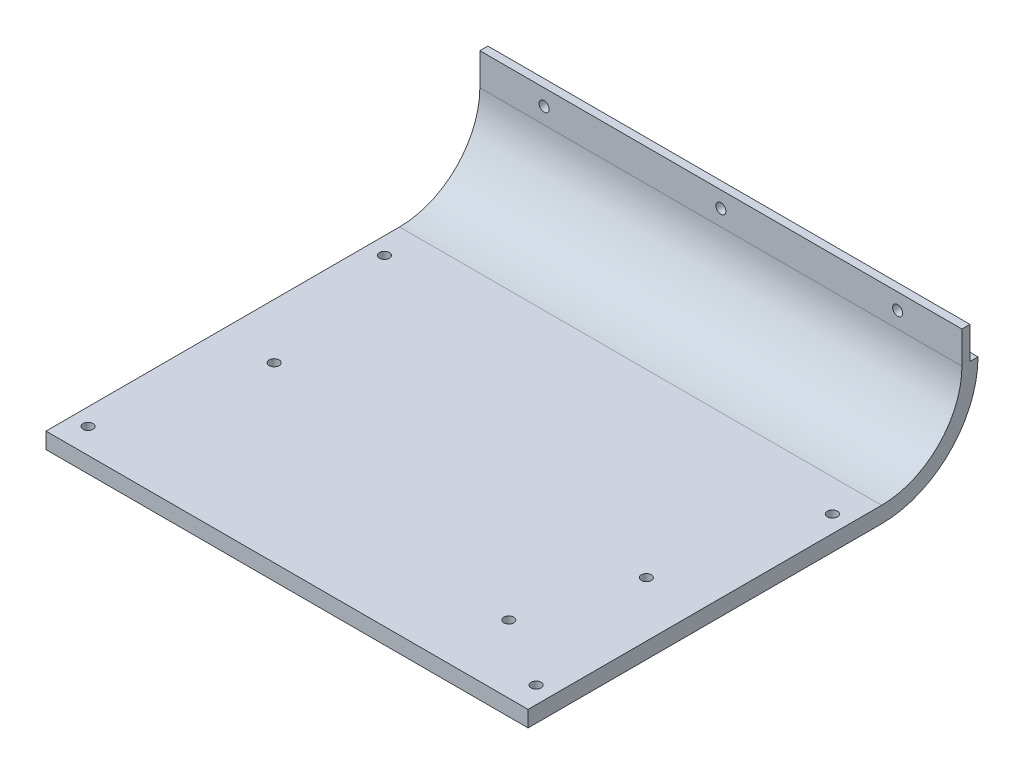
ISO-10303-21;
HEADER;
FILE_DESCRIPTION(('STEP AP214'),'2;1');
FILE_NAME('part.step','',(''),(''),'','','');
FILE_SCHEMA(('AUTOMOTIVE_DESIGN { 1 0 10303 214 1 1 1 1 }'));
ENDSEC;
DATA;
#1=APPLICATION_CONTEXT('core data for automotive mechanical design processes');
#2=APPLICATION_PROTOCOL_DEFINITION('international standard','automotive_design',2000,#1);
#3=PRODUCT_CONTEXT('',#1,'mechanical');
#4=PRODUCT('Part','Part','',(#3));
#5=PRODUCT_RELATED_PRODUCT_CATEGORY('part','',(#4));
#6=PRODUCT_DEFINITION_FORMATION('','',#4);
#7=PRODUCT_DEFINITION_CONTEXT('part definition',#1,'design');
#8=PRODUCT_DEFINITION('design','',#6,#7);
#9=PRODUCT_DEFINITION_SHAPE('','',#8);
#10=(LENGTH_UNIT() NAMED_UNIT(*) SI_UNIT(.MILLI.,.METRE.));
#11=(NAMED_UNIT(*) PLANE_ANGLE_UNIT() SI_UNIT($,.RADIAN.));
#12=(NAMED_UNIT(*) SI_UNIT($,.STERADIAN.) SOLID_ANGLE_UNIT());
#13=UNCERTAINTY_MEASURE_WITH_UNIT(LENGTH_MEASURE(1.E-05),#10,'distance_accuracy_value','');
#14=(GEOMETRIC_REPRESENTATION_CONTEXT(3) GLOBAL_UNCERTAINTY_ASSIGNED_CONTEXT((#13)) GLOBAL_UNIT_ASSIGNED_CONTEXT((#10,
#11,#12)) REPRESENTATION_CONTEXT('',''));
#15=CARTESIAN_POINT('',(0.,0.,0.));
#16=DIRECTION('',(0.,0.,1.));
#17=DIRECTION('',(1.,0.,0.));
#18=AXIS2_PLACEMENT_3D('',#15,#16,#17);
#19=CARTESIAN_POINT('',(-190.5,76.2,-139.7));
#20=DIRECTION('',(1.,0.,0.));
#21=DIRECTION('',(0.,0.,-1.));
#22=AXIS2_PLACEMENT_3D('',#19,#20,#21);
#23=CYLINDRICAL_SURFACE('',#22,76.2);
#24=DIRECTION('',(1.,0.,0.));
#25=VECTOR('',#24,1.);
#26=CARTESIAN_POINT('',(-190.5,76.2,-215.9));
#27=LINE('',#26,#25);
#28=CARTESIAN_POINT('',(-190.5,76.2,-215.9));
#29=VERTEX_POINT('',#28);
#30=CARTESIAN_POINT('',(190.5,76.2,-215.9));
#31=VERTEX_POINT('',#30);
#32=EDGE_CURVE('E50',#29,#31,#27,.T.);
#33=ORIENTED_EDGE('',*,*,#32,.T.);
#34=CARTESIAN_POINT('',(190.5,76.2,-139.7));
#35=DIRECTION('',(1.,0.,0.));
#36=DIRECTION('',(0.,0.,1.));
#37=AXIS2_PLACEMENT_3D('',#34,#35,#36);
#38=CIRCLE('',#37,76.2);
#39=CARTESIAN_POINT('',(190.5,0.,-139.7));
#40=VERTEX_POINT('',#39);
#41=EDGE_CURVE('E149',#40,#31,#38,.T.);
#42=ORIENTED_EDGE('',*,*,#41,.F.);
#43=DIRECTION('',(1.,0.,0.));
#44=VECTOR('',#43,1.);
#45=CARTESIAN_POINT('',(-190.5,0.,-139.7));
#46=LINE('',#45,#44);
#47=CARTESIAN_POINT('',(-190.5,0.,-139.7));
#48=VERTEX_POINT('',#47);
#49=EDGE_CURVE('E11',#48,#40,#46,.T.);
#50=ORIENTED_EDGE('',*,*,#49,.F.);
#51=CARTESIAN_POINT('',(-190.5,76.2,-139.7));
#52=DIRECTION('',(1.,0.,0.));
#53=DIRECTION('',(0.,0.,1.));
#54=AXIS2_PLACEMENT_3D('',#51,#52,#53);
#55=CIRCLE('',#54,76.2);
#56=EDGE_CURVE('E180',#48,#29,#55,.T.);
#57=ORIENTED_EDGE('',*,*,#56,.T.);
#58=EDGE_LOOP('',(#33,#42,#50,#57));
#59=FACE_BOUND('',#58,.T.);
#60=ADVANCED_FACE('F47',(#59),#23,.T.);
#61=CARTESIAN_POINT('',(-190.5,0.,139.7));
#62=DIRECTION('',(0.,-1.,0.));
#63=DIRECTION('',(0.,0.,-1.));
#64=AXIS2_PLACEMENT_3D('',#61,#62,#63);
#65=PLANE('',#64);
#66=CARTESIAN_POINT('',(-177.038,0.,119.888));
#67=DIRECTION('',(0.,1.,0.));
#68=DIRECTION('',(0.,0.,-1.));
#69=AXIS2_PLACEMENT_3D('',#66,#67,#68);
#70=CIRCLE('',#69,3.937);
#71=CARTESIAN_POINT('',(-177.038,0.,115.951));
#72=VERTEX_POINT('',#71);
#73=EDGE_CURVE('E343',#72,#72,#70,.T.);
#74=ORIENTED_EDGE('',*,*,#73,.T.);
#75=EDGE_LOOP('',(#74));
#76=FACE_BOUND('',#75,.T.);
#77=CARTESIAN_POINT('',(177.038,0.,-114.3));
#78=DIRECTION('',(0.,1.,0.));
#79=DIRECTION('',(0.,0.,1.));
#80=AXIS2_PLACEMENT_3D('',#77,#78,#79);
#81=CIRCLE('',#80,3.937);
#82=CARTESIAN_POINT('',(177.038,0.,-110.363));
#83=VERTEX_POINT('',#82);
#84=EDGE_CURVE('E331',#83,#83,#81,.T.);
#85=ORIENTED_EDGE('',*,*,#84,.T.);
#86=EDGE_LOOP('',(#85));
#87=FACE_BOUND('',#86,.T.);
#88=CARTESIAN_POINT('',(177.038,0.,119.888));
#89=DIRECTION('',(0.,1.,0.));
#90=DIRECTION('',(0.,0.,1.));
#91=AXIS2_PLACEMENT_3D('',#88,#89,#90);
#92=CIRCLE('',#91,3.937);
#93=CARTESIAN_POINT('',(177.038,0.,123.825));
#94=VERTEX_POINT('',#93);
#95=EDGE_CURVE('E319',#94,#94,#92,.T.);
#96=ORIENTED_EDGE('',*,*,#95,.T.);
#97=EDGE_LOOP('',(#96));
#98=FACE_BOUND('',#97,.T.);
#99=CARTESIAN_POINT('',(-147.066,0.,2.79399999999996));
#100=DIRECTION('',(0.,1.,0.));
#101=DIRECTION('',(0.,0.,1.));
#102=AXIS2_PLACEMENT_3D('',#99,#100,#101);
#103=CIRCLE('',#102,3.937);
#104=CARTESIAN_POINT('',(-147.066,0.,6.73099999999996));
#105=VERTEX_POINT('',#104);
#106=EDGE_CURVE('E307',#105,#105,#103,.T.);
#107=ORIENTED_EDGE('',*,*,#106,.T.);
#108=EDGE_LOOP('',(#107));
#109=FACE_BOUND('',#108,.T.);
#110=CARTESIAN_POINT('',(-177.038,0.,-114.3));
#111=DIRECTION('',(0.,1.,0.));
#112=DIRECTION('',(0.,0.,-1.));
#113=AXIS2_PLACEMENT_3D('',#110,#111,#112);
#114=CIRCLE('',#113,3.937);
#115=CARTESIAN_POINT('',(-177.038,0.,-118.237));
#116=VERTEX_POINT('',#115);
#117=EDGE_CURVE('E355',#116,#116,#114,.T.);
#118=ORIENTED_EDGE('',*,*,#117,.T.);
#119=EDGE_LOOP('',(#118));
#120=FACE_BOUND('',#119,.T.);
#121=CARTESIAN_POINT('',(121.666,0.,86.106));
#122=DIRECTION('',(0.,1.,0.));
#123=DIRECTION('',(0.,0.,1.));
#124=AXIS2_PLACEMENT_3D('',#121,#122,#123);
#125=CIRCLE('',#124,3.93700000000001);
#126=CARTESIAN_POINT('',(121.666,0.,90.043));
#127=VERTEX_POINT('',#126);
#128=EDGE_CURVE('E367',#127,#127,#125,.T.);
#129=ORIENTED_EDGE('',*,*,#128,.T.);
#130=EDGE_LOOP('',(#129));
#131=FACE_BOUND('',#130,.T.);
#132=CARTESIAN_POINT('',(147.066,0.,2.79399999999996));
#133=DIRECTION('',(0.,1.,0.));
#134=DIRECTION('',(0.,0.,1.));
#135=AXIS2_PLACEMENT_3D('',#132,#133,#134);
#136=CIRCLE('',#135,3.937);
#137=CARTESIAN_POINT('',(147.066,0.,6.73099999999996));
#138=VERTEX_POINT('',#137);
#139=EDGE_CURVE('E289',#138,#138,#136,.T.);
#140=ORIENTED_EDGE('',*,*,#139,.T.);
#141=EDGE_LOOP('',(#140));
#142=FACE_BOUND('',#141,.T.);
#143=ORIENTED_EDGE('',*,*,#49,.T.);
#144=DIRECTION('',(0.,0.,-1.));
#145=VECTOR('',#144,1.);
#146=CARTESIAN_POINT('',(190.5,0.,139.7));
#147=LINE('',#146,#145);
#148=CARTESIAN_POINT('',(190.5,0.,139.7));
#149=VERTEX_POINT('',#148);
#150=EDGE_CURVE('E176',#149,#40,#147,.T.);
#151=ORIENTED_EDGE('',*,*,#150,.F.);
#152=DIRECTION('',(1.,0.,0.));
#153=VECTOR('',#152,1.);
#154=CARTESIAN_POINT('',(-190.5,0.,139.7));
#155=LINE('',#154,#153);
#156=CARTESIAN_POINT('',(-190.5,0.,139.7));
#157=VERTEX_POINT('',#156);
#158=EDGE_CURVE('E56',#157,#149,#155,.T.);
#159=ORIENTED_EDGE('',*,*,#158,.F.);
#160=DIRECTION('',(0.,0.,-1.));
#161=VECTOR('',#160,1.);
#162=CARTESIAN_POINT('',(-190.5,0.,139.7));
#163=LINE('',#162,#161);
#164=EDGE_CURVE('E196',#157,#48,#163,.T.);
#165=ORIENTED_EDGE('',*,*,#164,.T.);
#166=EDGE_LOOP('',(#143,#151,#159,#165));
#167=FACE_BOUND('',#166,.T.);
#168=ADVANCED_FACE('F223',(#76,#87,#98,#109,#120,#131,#142,#167),#65,.T.);
#169=CARTESIAN_POINT('',(-190.5,0.,139.7));
#170=DIRECTION('',(0.,0.,1.));
#171=DIRECTION('',(1.,0.,0.));
#172=AXIS2_PLACEMENT_3D('',#169,#170,#171);
#173=PLANE('',#172);
#174=ORIENTED_EDGE('',*,*,#158,.T.);
#175=DIRECTION('',(0.,-1.,0.));
#176=VECTOR('',#175,1.);
#177=CARTESIAN_POINT('',(190.5,0.,139.7));
#178=LINE('',#177,#176);
#179=CARTESIAN_POINT('',(190.5,12.7,139.7));
#180=VERTEX_POINT('',#179);
#181=EDGE_CURVE('E172',#180,#149,#178,.T.);
#182=ORIENTED_EDGE('',*,*,#181,.F.);
#183=DIRECTION('',(1.,0.,0.));
#184=VECTOR('',#183,1.);
#185=CARTESIAN_POINT('',(-190.5,12.7,139.7));
#186=LINE('',#185,#184);
#187=CARTESIAN_POINT('',(-190.5,12.7,139.7));
#188=VERTEX_POINT('',#187);
#189=EDGE_CURVE('E202',#188,#180,#186,.T.);
#190=ORIENTED_EDGE('',*,*,#189,.F.);
#191=DIRECTION('',(0.,-1.,0.));
#192=VECTOR('',#191,1.);
#193=CARTESIAN_POINT('',(-190.5,0.,139.7));
#194=LINE('',#193,#192);
#195=EDGE_CURVE('E192',#188,#157,#194,.T.);
#196=ORIENTED_EDGE('',*,*,#195,.T.);
#197=EDGE_LOOP('',(#174,#182,#190,#196));
#198=FACE_BOUND('',#197,.T.);
#199=ADVANCED_FACE('F390',(#198),#173,.T.);
#200=CARTESIAN_POINT('',(-190.5,12.7,139.7));
#201=DIRECTION('',(0.,1.,0.));
#202=DIRECTION('',(0.,0.,1.));
#203=AXIS2_PLACEMENT_3D('',#200,#201,#202);
#204=PLANE('',#203);
#205=CARTESIAN_POINT('',(-177.038,12.7,119.888));
#206=DIRECTION('',(0.,1.,0.));
#207=DIRECTION('',(0.,0.,-1.));
#208=AXIS2_PLACEMENT_3D('',#205,#206,#207);
#209=CIRCLE('',#208,3.937);
#210=CARTESIAN_POINT('',(-177.038,12.7,115.951));
#211=VERTEX_POINT('',#210);
#212=EDGE_CURVE('E337',#211,#211,#209,.T.);
#213=ORIENTED_EDGE('',*,*,#212,.F.);
#214=EDGE_LOOP('',(#213));
#215=FACE_BOUND('',#214,.T.);
#216=CARTESIAN_POINT('',(177.038,12.7,-114.3));
#217=DIRECTION('',(0.,1.,0.));
#218=DIRECTION('',(0.,0.,1.));
#219=AXIS2_PLACEMENT_3D('',#216,#217,#218);
#220=CIRCLE('',#219,3.937);
#221=CARTESIAN_POINT('',(177.038,12.7,-110.363));
#222=VERTEX_POINT('',#221);
#223=EDGE_CURVE('E325',#222,#222,#220,.T.);
#224=ORIENTED_EDGE('',*,*,#223,.F.);
#225=EDGE_LOOP('',(#224));
#226=FACE_BOUND('',#225,.T.);
#227=CARTESIAN_POINT('',(177.038,12.7,119.888));
#228=DIRECTION('',(0.,1.,0.));
#229=DIRECTION('',(0.,0.,1.));
#230=AXIS2_PLACEMENT_3D('',#227,#228,#229);
#231=CIRCLE('',#230,3.937);
#232=CARTESIAN_POINT('',(177.038,12.7,123.825));
#233=VERTEX_POINT('',#232);
#234=EDGE_CURVE('E313',#233,#233,#231,.T.);
#235=ORIENTED_EDGE('',*,*,#234,.F.);
#236=EDGE_LOOP('',(#235));
#237=FACE_BOUND('',#236,.T.);
#238=CARTESIAN_POINT('',(-147.066,12.7,2.79399999999996));
#239=DIRECTION('',(0.,1.,0.));
#240=DIRECTION('',(0.,0.,1.));
#241=AXIS2_PLACEMENT_3D('',#238,#239,#240);
#242=CIRCLE('',#241,3.937);
#243=CARTESIAN_POINT('',(-147.066,12.7,6.73099999999996));
#244=VERTEX_POINT('',#243);
#245=EDGE_CURVE('E301',#244,#244,#242,.T.);
#246=ORIENTED_EDGE('',*,*,#245,.F.);
#247=EDGE_LOOP('',(#246));
#248=FACE_BOUND('',#247,.T.);
#249=CARTESIAN_POINT('',(-177.038,12.7,-114.3));
#250=DIRECTION('',(0.,1.,0.));
#251=DIRECTION('',(0.,0.,-1.));
#252=AXIS2_PLACEMENT_3D('',#249,#250,#251);
#253=CIRCLE('',#252,3.937);
#254=CARTESIAN_POINT('',(-177.038,12.7,-118.237));
#255=VERTEX_POINT('',#254);
#256=EDGE_CURVE('E349',#255,#255,#253,.T.);
#257=ORIENTED_EDGE('',*,*,#256,.F.);
#258=EDGE_LOOP('',(#257));
#259=FACE_BOUND('',#258,.T.);
#260=CARTESIAN_POINT('',(121.666,12.7,86.106));
#261=DIRECTION('',(0.,1.,0.));
#262=DIRECTION('',(0.,0.,1.));
#263=AXIS2_PLACEMENT_3D('',#260,#261,#262);
#264=CIRCLE('',#263,3.93700000000001);
#265=CARTESIAN_POINT('',(121.666,12.7,90.043));
#266=VERTEX_POINT('',#265);
#267=EDGE_CURVE('E361',#266,#266,#264,.T.);
#268=ORIENTED_EDGE('',*,*,#267,.F.);
#269=EDGE_LOOP('',(#268));
#270=FACE_BOUND('',#269,.T.);
#271=CARTESIAN_POINT('',(147.066,12.7,2.79399999999996));
#272=DIRECTION('',(0.,1.,0.));
#273=DIRECTION('',(0.,0.,1.));
#274=AXIS2_PLACEMENT_3D('',#271,#272,#273);
#275=CIRCLE('',#274,3.937);
#276=CARTESIAN_POINT('',(147.066,12.7,6.73099999999996));
#277=VERTEX_POINT('',#276);
#278=EDGE_CURVE('E295',#277,#277,#275,.T.);
#279=ORIENTED_EDGE('',*,*,#278,.F.);
#280=EDGE_LOOP('',(#279));
#281=FACE_BOUND('',#280,.T.);
#282=ORIENTED_EDGE('',*,*,#189,.T.);
#283=DIRECTION('',(0.,0.,1.));
#284=VECTOR('',#283,1.);
#285=CARTESIAN_POINT('',(190.5,12.7,139.7));
#286=LINE('',#285,#284);
#287=CARTESIAN_POINT('',(190.5,12.7,-139.7));
#288=VERTEX_POINT('',#287);
#289=EDGE_CURVE('E168',#288,#180,#286,.T.);
#290=ORIENTED_EDGE('',*,*,#289,.F.);
#291=DIRECTION('',(1.,0.,0.));
#292=VECTOR('',#291,1.);
#293=CARTESIAN_POINT('',(-190.5,12.7,-139.7));
#294=LINE('',#293,#292);
#295=CARTESIAN_POINT('',(-190.5,12.7,-139.7));
#296=VERTEX_POINT('',#295);
#297=EDGE_CURVE('E205',#296,#288,#294,.T.);
#298=ORIENTED_EDGE('',*,*,#297,.F.);
#299=DIRECTION('',(0.,0.,1.));
#300=VECTOR('',#299,1.);
#301=CARTESIAN_POINT('',(-190.5,12.7,139.7));
#302=LINE('',#301,#300);
#303=EDGE_CURVE('E188',#296,#188,#302,.T.);
#304=ORIENTED_EDGE('',*,*,#303,.T.);
#305=EDGE_LOOP('',(#282,#290,#298,#304));
#306=FACE_BOUND('',#305,.T.);
#307=ADVANCED_FACE('F386',(#215,#226,#237,#248,#259,#270,#281,#306),#204,.T.);
#308=CARTESIAN_POINT('',(-190.5,76.2,-139.7));
#309=DIRECTION('',(1.,0.,0.));
#310=DIRECTION('',(0.,0.,-1.));
#311=AXIS2_PLACEMENT_3D('',#308,#309,#310);
#312=CYLINDRICAL_SURFACE('',#311,63.5);
#313=ORIENTED_EDGE('',*,*,#297,.T.);
#314=CARTESIAN_POINT('',(190.5,76.2,-139.7));
#315=DIRECTION('',(-1.,0.,0.));
#316=DIRECTION('',(0.,0.,1.));
#317=AXIS2_PLACEMENT_3D('',#314,#315,#316);
#318=CIRCLE('',#317,63.5);
#319=CARTESIAN_POINT('',(190.5,76.2,-203.2));
#320=VERTEX_POINT('',#319);
#321=EDGE_CURVE('E164',#320,#288,#318,.T.);
#322=ORIENTED_EDGE('',*,*,#321,.F.);
#323=DIRECTION('',(1.,0.,0.));
#324=VECTOR('',#323,1.);
#325=CARTESIAN_POINT('',(-190.5,76.2,-203.2));
#326=LINE('',#325,#324);
#327=CARTESIAN_POINT('',(-190.5,76.2,-203.2));
#328=VERTEX_POINT('',#327);
#329=EDGE_CURVE('E207',#328,#320,#326,.T.);
#330=ORIENTED_EDGE('',*,*,#329,.F.);
#331=CARTESIAN_POINT('',(-190.5,76.2,-139.7));
#332=DIRECTION('',(-1.,0.,0.));
#333=DIRECTION('',(0.,0.,1.));
#334=AXIS2_PLACEMENT_3D('',#331,#332,#333);
#335=CIRCLE('',#334,63.5);
#336=EDGE_CURVE('E147',#328,#296,#335,.T.);
#337=ORIENTED_EDGE('',*,*,#336,.T.);
#338=EDGE_LOOP('',(#313,#322,#330,#337));
#339=FACE_BOUND('',#338,.T.);
#340=ADVANCED_FACE('F389',(#339),#312,.F.);
#341=CARTESIAN_POINT('',(-190.5,76.2,-203.2));
#342=DIRECTION('',(0.,1.,0.));
#343=DIRECTION('',(0.,0.,1.));
#344=AXIS2_PLACEMENT_3D('',#341,#342,#343);
#345=PLANE('',#344);
#346=DIRECTION('',(-1.,0.,0.));
#347=VECTOR('',#346,1.);
#348=CARTESIAN_POINT('',(-190.5,76.2,-209.55));
#349=LINE('',#348,#347);
#350=CARTESIAN_POINT('',(190.5,76.2,-209.55));
#351=VERTEX_POINT('',#350);
#352=CARTESIAN_POINT('',(-190.5,76.2,-209.55));
#353=VERTEX_POINT('',#352);
#354=EDGE_CURVE('E64',#351,#353,#349,.T.);
#355=ORIENTED_EDGE('',*,*,#354,.F.);
#356=DIRECTION('',(0.,0.,1.));
#357=VECTOR('',#356,1.);
#358=CARTESIAN_POINT('',(190.5,76.2,-203.2));
#359=LINE('',#358,#357);
#360=EDGE_CURVE('E156',#31,#351,#359,.T.);
#361=ORIENTED_EDGE('',*,*,#360,.F.);
#362=ORIENTED_EDGE('',*,*,#32,.F.);
#363=DIRECTION('',(0.,0.,1.));
#364=VECTOR('',#363,1.);
#365=CARTESIAN_POINT('',(-190.5,76.2,-203.2));
#366=LINE('',#365,#364);
#367=EDGE_CURVE('E183',#29,#353,#366,.T.);
#368=ORIENTED_EDGE('',*,*,#367,.T.);
#369=EDGE_LOOP('',(#355,#361,#362,#368));
#370=FACE_BOUND('',#369,.T.);
#371=ADVANCED_FACE('F215',(#370),#345,.T.);
#372=CARTESIAN_POINT('',(-190.5,76.2,-139.7));
#373=DIRECTION('',(-1.,0.,0.));
#374=DIRECTION('',(0.,0.,1.));
#375=AXIS2_PLACEMENT_3D('',#372,#373,#374);
#376=PLANE('',#375);
#377=ORIENTED_EDGE('',*,*,#56,.F.);
#378=ORIENTED_EDGE('',*,*,#164,.F.);
#379=ORIENTED_EDGE('',*,*,#195,.F.);
#380=ORIENTED_EDGE('',*,*,#303,.F.);
#381=ORIENTED_EDGE('',*,*,#336,.F.);
#382=DIRECTION('',(0.,-1.,0.));
#383=VECTOR('',#382,1.);
#384=CARTESIAN_POINT('',(-190.5,101.6,-203.2));
#385=LINE('',#384,#383);
#386=CARTESIAN_POINT('',(-190.5,101.6,-203.2));
#387=VERTEX_POINT('',#386);
#388=EDGE_CURVE('E125',#387,#328,#385,.T.);
#389=ORIENTED_EDGE('',*,*,#388,.F.);
#390=DIRECTION('',(0.,0.,1.));
#391=VECTOR('',#390,1.);
#392=CARTESIAN_POINT('',(-190.5,101.6,-209.55));
#393=LINE('',#392,#391);
#394=CARTESIAN_POINT('',(-190.5,101.6,-209.55));
#395=VERTEX_POINT('',#394);
#396=EDGE_CURVE('E132',#395,#387,#393,.T.);
#397=ORIENTED_EDGE('',*,*,#396,.F.);
#398=DIRECTION('',(0.,-1.,0.));
#399=VECTOR('',#398,1.);
#400=CARTESIAN_POINT('',(-190.5,101.6,-209.55));
#401=LINE('',#400,#399);
#402=EDGE_CURVE('E226',#395,#353,#401,.T.);
#403=ORIENTED_EDGE('',*,*,#402,.T.);
#404=ORIENTED_EDGE('',*,*,#367,.F.);
#405=EDGE_LOOP('',(#377,#378,#379,#380,#381,#389,#397,#403,#404));
#406=FACE_BOUND('',#405,.T.);
#407=ADVANCED_FACE('F144',(#406),#376,.T.);
#408=CARTESIAN_POINT('',(190.5,76.2,-139.7));
#409=DIRECTION('',(-1.,0.,0.));
#410=DIRECTION('',(0.,0.,1.));
#411=AXIS2_PLACEMENT_3D('',#408,#409,#410);
#412=PLANE('',#411);
#413=ORIENTED_EDGE('',*,*,#41,.T.);
#414=ORIENTED_EDGE('',*,*,#360,.T.);
#415=DIRECTION('',(0.,-1.,0.));
#416=VECTOR('',#415,1.);
#417=CARTESIAN_POINT('',(190.5,101.6,-209.55));
#418=LINE('',#417,#416);
#419=CARTESIAN_POINT('',(190.5,101.6,-209.55));
#420=VERTEX_POINT('',#419);
#421=EDGE_CURVE('E158',#420,#351,#418,.T.);
#422=ORIENTED_EDGE('',*,*,#421,.F.);
#423=DIRECTION('',(0.,0.,-1.));
#424=VECTOR('',#423,1.);
#425=CARTESIAN_POINT('',(190.5,101.6,-209.55));
#426=LINE('',#425,#424);
#427=CARTESIAN_POINT('',(190.5,101.6,-203.2));
#428=VERTEX_POINT('',#427);
#429=EDGE_CURVE('E131',#428,#420,#426,.T.);
#430=ORIENTED_EDGE('',*,*,#429,.F.);
#431=DIRECTION('',(0.,-1.,0.));
#432=VECTOR('',#431,1.);
#433=CARTESIAN_POINT('',(190.5,101.6,-203.2));
#434=LINE('',#433,#432);
#435=EDGE_CURVE('E127',#428,#320,#434,.T.);
#436=ORIENTED_EDGE('',*,*,#435,.T.);
#437=ORIENTED_EDGE('',*,*,#321,.T.);
#438=ORIENTED_EDGE('',*,*,#289,.T.);
#439=ORIENTED_EDGE('',*,*,#181,.T.);
#440=ORIENTED_EDGE('',*,*,#150,.T.);
#441=EDGE_LOOP('',(#413,#414,#422,#430,#436,#437,#438,#439,#440));
#442=FACE_BOUND('',#441,.T.);
#443=ADVANCED_FACE('F219',(#442),#412,.F.);
#444=CARTESIAN_POINT('',(-190.5,101.6,-203.2));
#445=DIRECTION('',(0.,0.,-1.));
#446=DIRECTION('',(-1.,0.,0.));
#447=AXIS2_PLACEMENT_3D('',#444,#445,#446);
#448=PLANE('',#447);
#449=CARTESIAN_POINT('',(139.7,88.9,-203.2));
#450=DIRECTION('',(0.,0.,-1.));
#451=DIRECTION('',(-1.,0.,0.));
#452=AXIS2_PLACEMENT_3D('',#449,#450,#451);
#453=CIRCLE('',#452,3.96874999999999);
#454=CARTESIAN_POINT('',(135.73125,88.9,-203.2));
#455=VERTEX_POINT('',#454);
#456=EDGE_CURVE('E230',#455,#455,#453,.T.);
#457=ORIENTED_EDGE('',*,*,#456,.T.);
#458=EDGE_LOOP('',(#457));
#459=FACE_BOUND('',#458,.T.);
#460=CARTESIAN_POINT('',(-139.7,88.9,-203.2));
#461=DIRECTION('',(0.,0.,-1.));
#462=DIRECTION('',(-1.,0.,0.));
#463=AXIS2_PLACEMENT_3D('',#460,#461,#462);
#464=CIRCLE('',#463,3.96874999999999);
#465=CARTESIAN_POINT('',(-143.66875,88.9,-203.2));
#466=VERTEX_POINT('',#465);
#467=EDGE_CURVE('E236',#466,#466,#464,.T.);
#468=ORIENTED_EDGE('',*,*,#467,.T.);
#469=EDGE_LOOP('',(#468));
#470=FACE_BOUND('',#469,.T.);
#471=CARTESIAN_POINT('',(0.,88.9,-203.2));
#472=DIRECTION('',(0.,0.,-1.));
#473=DIRECTION('',(-1.,0.,0.));
#474=AXIS2_PLACEMENT_3D('',#471,#472,#473);
#475=CIRCLE('',#474,3.96875);
#476=CARTESIAN_POINT('',(-3.96875,88.9,-203.2));
#477=VERTEX_POINT('',#476);
#478=EDGE_CURVE('E265',#477,#477,#475,.T.);
#479=ORIENTED_EDGE('',*,*,#478,.T.);
#480=EDGE_LOOP('',(#479));
#481=FACE_BOUND('',#480,.T.);
#482=ORIENTED_EDGE('',*,*,#329,.T.);
#483=ORIENTED_EDGE('',*,*,#435,.F.);
#484=DIRECTION('',(1.,0.,0.));
#485=VECTOR('',#484,1.);
#486=CARTESIAN_POINT('',(-190.5,101.6,-203.2));
#487=LINE('',#486,#485);
#488=EDGE_CURVE('E120',#387,#428,#487,.T.);
#489=ORIENTED_EDGE('',*,*,#488,.F.);
#490=ORIENTED_EDGE('',*,*,#388,.T.);
#491=EDGE_LOOP('',(#482,#483,#489,#490));
#492=FACE_BOUND('',#491,.T.);
#493=ADVANCED_FACE('F123',(#459,#470,#481,#492),#448,.F.);
#494=CARTESIAN_POINT('',(-190.5,101.6,-209.55));
#495=DIRECTION('',(0.,0.,1.));
#496=DIRECTION('',(1.,0.,0.));
#497=AXIS2_PLACEMENT_3D('',#494,#495,#496);
#498=PLANE('',#497);
#499=CARTESIAN_POINT('',(139.7,88.9,-209.55));
#500=DIRECTION('',(0.,0.,-1.));
#501=DIRECTION('',(-1.,0.,0.));
#502=AXIS2_PLACEMENT_3D('',#499,#500,#501);
#503=CIRCLE('',#502,3.96874999999999);
#504=CARTESIAN_POINT('',(135.73125,88.9,-209.55));
#505=VERTEX_POINT('',#504);
#506=EDGE_CURVE('E271',#505,#505,#503,.T.);
#507=ORIENTED_EDGE('',*,*,#506,.F.);
#508=EDGE_LOOP('',(#507));
#509=FACE_BOUND('',#508,.T.);
#510=CARTESIAN_POINT('',(-139.7,88.9,-209.55));
#511=DIRECTION('',(0.,0.,-1.));
#512=DIRECTION('',(-1.,0.,0.));
#513=AXIS2_PLACEMENT_3D('',#510,#511,#512);
#514=CIRCLE('',#513,3.96874999999999);
#515=CARTESIAN_POINT('',(-143.66875,88.9,-209.55));
#516=VERTEX_POINT('',#515);
#517=EDGE_CURVE('E277',#516,#516,#514,.T.);
#518=ORIENTED_EDGE('',*,*,#517,.F.);
#519=EDGE_LOOP('',(#518));
#520=FACE_BOUND('',#519,.T.);
#521=CARTESIAN_POINT('',(0.,88.9,-209.55));
#522=DIRECTION('',(0.,0.,-1.));
#523=DIRECTION('',(-1.,0.,0.));
#524=AXIS2_PLACEMENT_3D('',#521,#522,#523);
#525=CIRCLE('',#524,3.96875);
#526=CARTESIAN_POINT('',(-3.96875,88.9,-209.55));
#527=VERTEX_POINT('',#526);
#528=EDGE_CURVE('E283',#527,#527,#525,.T.);
#529=ORIENTED_EDGE('',*,*,#528,.F.);
#530=EDGE_LOOP('',(#529));
#531=FACE_BOUND('',#530,.T.);
#532=ORIENTED_EDGE('',*,*,#354,.T.);
#533=ORIENTED_EDGE('',*,*,#402,.F.);
#534=DIRECTION('',(-1.,0.,0.));
#535=VECTOR('',#534,1.);
#536=CARTESIAN_POINT('',(-190.5,101.6,-209.55));
#537=LINE('',#536,#535);
#538=EDGE_CURVE('E137',#420,#395,#537,.T.);
#539=ORIENTED_EDGE('',*,*,#538,.F.);
#540=ORIENTED_EDGE('',*,*,#421,.T.);
#541=EDGE_LOOP('',(#532,#533,#539,#540));
#542=FACE_BOUND('',#541,.T.);
#543=ADVANCED_FACE('F228',(#509,#520,#531,#542),#498,.F.);
#544=CARTESIAN_POINT('',(0.,101.6,0.));
#545=DIRECTION('',(0.,1.,0.));
#546=DIRECTION('',(0.,0.,1.));
#547=AXIS2_PLACEMENT_3D('',#544,#545,#546);
#548=PLANE('',#547);
#549=ORIENTED_EDGE('',*,*,#396,.T.);
#550=ORIENTED_EDGE('',*,*,#488,.T.);
#551=ORIENTED_EDGE('',*,*,#429,.T.);
#552=ORIENTED_EDGE('',*,*,#538,.T.);
#553=EDGE_LOOP('',(#549,#550,#551,#552));
#554=FACE_BOUND('',#553,.T.);
#555=ADVANCED_FACE('F135',(#554),#548,.T.);
#556=CARTESIAN_POINT('',(0.,88.9,-184.15));
#557=DIRECTION('',(0.,0.,-1.));
#558=DIRECTION('',(-1.,0.,0.));
#559=AXIS2_PLACEMENT_3D('',#556,#557,#558);
#560=CYLINDRICAL_SURFACE('',#559,3.96875);
#561=ORIENTED_EDGE('',*,*,#528,.T.);
#562=EDGE_LOOP('',(#561));
#563=FACE_BOUND('',#562,.T.);
#564=ORIENTED_EDGE('',*,*,#478,.F.);
#565=EDGE_LOOP('',(#564));
#566=FACE_BOUND('',#565,.T.);
#567=ADVANCED_FACE('F491',(#563,#566),#560,.F.);
#568=CARTESIAN_POINT('',(-139.7,88.9,-184.15));
#569=DIRECTION('',(0.,0.,-1.));
#570=DIRECTION('',(-1.,0.,0.));
#571=AXIS2_PLACEMENT_3D('',#568,#569,#570);
#572=CYLINDRICAL_SURFACE('',#571,3.96874999999999);
#573=ORIENTED_EDGE('',*,*,#517,.T.);
#574=EDGE_LOOP('',(#573));
#575=FACE_BOUND('',#574,.T.);
#576=ORIENTED_EDGE('',*,*,#467,.F.);
#577=EDGE_LOOP('',(#576));
#578=FACE_BOUND('',#577,.T.);
#579=ADVANCED_FACE('F499',(#575,#578),#572,.F.);
#580=CARTESIAN_POINT('',(139.7,88.9,-184.15));
#581=DIRECTION('',(0.,0.,-1.));
#582=DIRECTION('',(-1.,0.,0.));
#583=AXIS2_PLACEMENT_3D('',#580,#581,#582);
#584=CYLINDRICAL_SURFACE('',#583,3.96874999999999);
#585=ORIENTED_EDGE('',*,*,#506,.T.);
#586=EDGE_LOOP('',(#585));
#587=FACE_BOUND('',#586,.T.);
#588=ORIENTED_EDGE('',*,*,#456,.F.);
#589=EDGE_LOOP('',(#588));
#590=FACE_BOUND('',#589,.T.);
#591=ADVANCED_FACE('F509',(#587,#590),#584,.F.);
#592=CARTESIAN_POINT('',(147.066,0.,2.79399999999996));
#593=DIRECTION('',(0.,1.,0.));
#594=DIRECTION('',(0.,0.,1.));
#595=AXIS2_PLACEMENT_3D('',#592,#593,#594);
#596=CYLINDRICAL_SURFACE('',#595,3.937);
#597=ORIENTED_EDGE('',*,*,#139,.F.);
#598=EDGE_LOOP('',(#597));
#599=FACE_BOUND('',#598,.T.);
#600=ORIENTED_EDGE('',*,*,#278,.T.);
#601=EDGE_LOOP('',(#600));
#602=FACE_BOUND('',#601,.T.);
#603=ADVANCED_FACE('F382',(#599,#602),#596,.F.);
#604=CARTESIAN_POINT('',(121.666,0.,86.106));
#605=DIRECTION('',(0.,1.,0.));
#606=DIRECTION('',(0.,0.,1.));
#607=AXIS2_PLACEMENT_3D('',#604,#605,#606);
#608=CYLINDRICAL_SURFACE('',#607,3.93700000000001);
#609=ORIENTED_EDGE('',*,*,#128,.F.);
#610=EDGE_LOOP('',(#609));
#611=FACE_BOUND('',#610,.T.);
#612=ORIENTED_EDGE('',*,*,#267,.T.);
#613=EDGE_LOOP('',(#612));
#614=FACE_BOUND('',#613,.T.);
#615=ADVANCED_FACE('F378',(#611,#614),#608,.F.);
#616=CARTESIAN_POINT('',(-177.038,0.,-114.3));
#617=DIRECTION('',(0.,1.,0.));
#618=DIRECTION('',(0.,0.,1.));
#619=AXIS2_PLACEMENT_3D('',#616,#617,#618);
#620=CYLINDRICAL_SURFACE('',#619,3.937);
#621=ORIENTED_EDGE('',*,*,#117,.F.);
#622=EDGE_LOOP('',(#621));
#623=FACE_BOUND('',#622,.T.);
#624=ORIENTED_EDGE('',*,*,#256,.T.);
#625=EDGE_LOOP('',(#624));
#626=FACE_BOUND('',#625,.T.);
#627=ADVANCED_FACE('F381',(#623,#626),#620,.F.);
#628=CARTESIAN_POINT('',(-147.066,0.,2.79399999999996));
#629=DIRECTION('',(0.,1.,0.));
#630=DIRECTION('',(0.,0.,1.));
#631=AXIS2_PLACEMENT_3D('',#628,#629,#630);
#632=CYLINDRICAL_SURFACE('',#631,3.937);
#633=ORIENTED_EDGE('',*,*,#106,.F.);
#634=EDGE_LOOP('',(#633));
#635=FACE_BOUND('',#634,.T.);
#636=ORIENTED_EDGE('',*,*,#245,.T.);
#637=EDGE_LOOP('',(#636));
#638=FACE_BOUND('',#637,.T.);
#639=ADVANCED_FACE('F541',(#635,#638),#632,.F.);
#640=CARTESIAN_POINT('',(177.038,0.,119.888));
#641=DIRECTION('',(0.,1.,0.));
#642=DIRECTION('',(0.,0.,1.));
#643=AXIS2_PLACEMENT_3D('',#640,#641,#642);
#644=CYLINDRICAL_SURFACE('',#643,3.937);
#645=ORIENTED_EDGE('',*,*,#95,.F.);
#646=EDGE_LOOP('',(#645));
#647=FACE_BOUND('',#646,.T.);
#648=ORIENTED_EDGE('',*,*,#234,.T.);
#649=EDGE_LOOP('',(#648));
#650=FACE_BOUND('',#649,.T.);
#651=ADVANCED_FACE('F551',(#647,#650),#644,.F.);
#652=CARTESIAN_POINT('',(177.038,0.,-114.3));
#653=DIRECTION('',(0.,1.,0.));
#654=DIRECTION('',(0.,0.,1.));
#655=AXIS2_PLACEMENT_3D('',#652,#653,#654);
#656=CYLINDRICAL_SURFACE('',#655,3.937);
#657=ORIENTED_EDGE('',*,*,#84,.F.);
#658=EDGE_LOOP('',(#657));
#659=FACE_BOUND('',#658,.T.);
#660=ORIENTED_EDGE('',*,*,#223,.T.);
#661=EDGE_LOOP('',(#660));
#662=FACE_BOUND('',#661,.T.);
#663=ADVANCED_FACE('F561',(#659,#662),#656,.F.);
#664=CARTESIAN_POINT('',(-177.038,0.,119.888));
#665=DIRECTION('',(0.,1.,0.));
#666=DIRECTION('',(0.,0.,1.));
#667=AXIS2_PLACEMENT_3D('',#664,#665,#666);
#668=CYLINDRICAL_SURFACE('',#667,3.937);
#669=ORIENTED_EDGE('',*,*,#73,.F.);
#670=EDGE_LOOP('',(#669));
#671=FACE_BOUND('',#670,.T.);
#672=ORIENTED_EDGE('',*,*,#212,.T.);
#673=EDGE_LOOP('',(#672));
#674=FACE_BOUND('',#673,.T.);
#675=ADVANCED_FACE('F571',(#671,#674),#668,.F.);
#676=CLOSED_SHELL('',(#60,#168,#199,#307,#340,#371,#407,#443,#493,#543,#555,#567,#579,#591,#603,
#615,#627,#639,#651,#663,#675));
#677=MANIFOLD_SOLID_BREP('B2',#676);
#678=ADVANCED_BREP_SHAPE_REPRESENTATION('',(#18,#677),#14);
#679=SHAPE_DEFINITION_REPRESENTATION(#9,#678);
ENDSEC;
END-ISO-10303-21;
